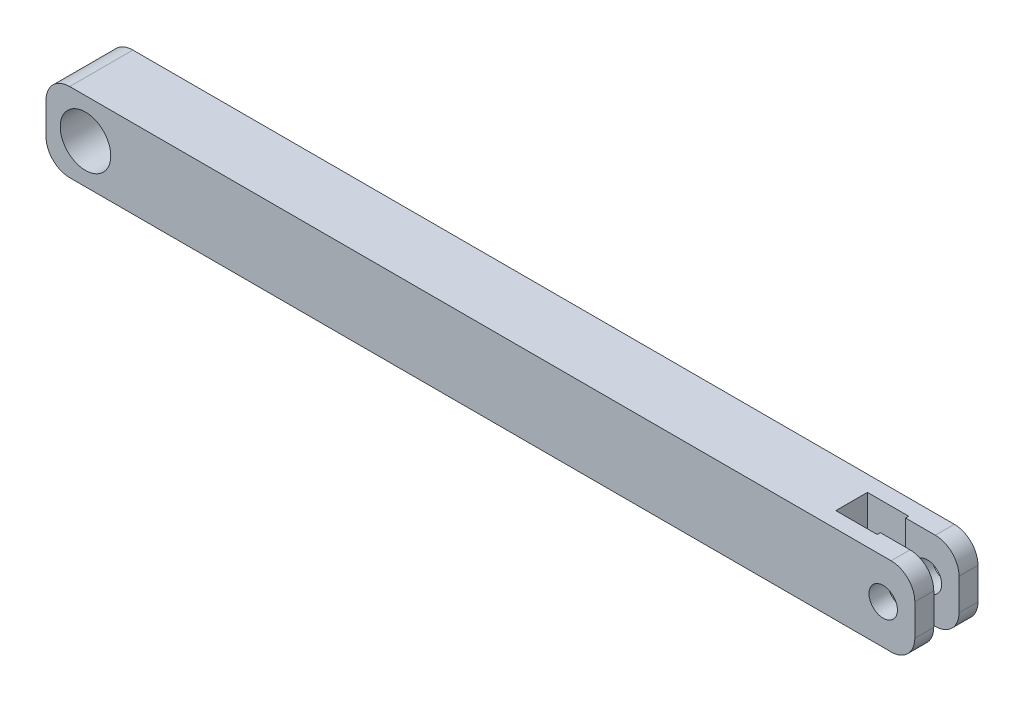
ISO-10303-21;
HEADER;
FILE_DESCRIPTION(('STEP AP214'),'2;1');
FILE_NAME('part.step','',(''),(''),'','','');
FILE_SCHEMA(('AUTOMOTIVE_DESIGN { 1 0 10303 214 1 1 1 1 }'));
ENDSEC;
DATA;
#1=APPLICATION_CONTEXT('core data for automotive mechanical design processes');
#2=APPLICATION_PROTOCOL_DEFINITION('international standard','automotive_design',2000,#1);
#3=PRODUCT_CONTEXT('',#1,'mechanical');
#4=PRODUCT('Part','Part','',(#3));
#5=PRODUCT_RELATED_PRODUCT_CATEGORY('part','',(#4));
#6=PRODUCT_DEFINITION_FORMATION('','',#4);
#7=PRODUCT_DEFINITION_CONTEXT('part definition',#1,'design');
#8=PRODUCT_DEFINITION('design','',#6,#7);
#9=PRODUCT_DEFINITION_SHAPE('','',#8);
#10=(LENGTH_UNIT() NAMED_UNIT(*) SI_UNIT(.MILLI.,.METRE.));
#11=(NAMED_UNIT(*) PLANE_ANGLE_UNIT() SI_UNIT($,.RADIAN.));
#12=(NAMED_UNIT(*) SI_UNIT($,.STERADIAN.) SOLID_ANGLE_UNIT());
#13=UNCERTAINTY_MEASURE_WITH_UNIT(LENGTH_MEASURE(1.E-05),#10,'distance_accuracy_value','');
#14=(GEOMETRIC_REPRESENTATION_CONTEXT(3) GLOBAL_UNCERTAINTY_ASSIGNED_CONTEXT((#13)) GLOBAL_UNIT_ASSIGNED_CONTEXT((#10,
#11,#12)) REPRESENTATION_CONTEXT('',''));
#15=CARTESIAN_POINT('',(0.,0.,0.));
#16=DIRECTION('',(0.,0.,1.));
#17=DIRECTION('',(1.,0.,0.));
#18=AXIS2_PLACEMENT_3D('',#15,#16,#17);
#19=CARTESIAN_POINT('',(0.,5.,0.));
#20=DIRECTION('',(0.,1.,0.));
#21=DIRECTION('',(0.,0.,1.));
#22=AXIS2_PLACEMENT_3D('',#19,#20,#21);
#23=PLANE('',#22);
#24=DIRECTION('',(-1.,0.,0.));
#25=VECTOR('',#24,1.);
#26=CARTESIAN_POINT('',(0.,5.,2.50000000000001));
#27=LINE('',#26,#25);
#28=CARTESIAN_POINT('',(51.6165924289674,5.,2.5));
#29=VERTEX_POINT('',#28);
#30=CARTESIAN_POINT('',(49.,5.,2.5));
#31=VERTEX_POINT('',#30);
#32=EDGE_CURVE('E267',#29,#31,#27,.T.);
#33=ORIENTED_EDGE('',*,*,#32,.T.);
#34=DIRECTION('',(0.,0.,1.));
#35=VECTOR('',#34,1.);
#36=CARTESIAN_POINT('',(49.,5.,0.700000000000001));
#37=LINE('',#36,#35);
#38=CARTESIAN_POINT('',(49.,5.,0.500000000000002));
#39=VERTEX_POINT('',#38);
#40=EDGE_CURVE('E272',#39,#31,#37,.T.);
#41=ORIENTED_EDGE('',*,*,#40,.F.);
#42=DIRECTION('',(-1.,0.,0.));
#43=VECTOR('',#42,1.);
#44=CARTESIAN_POINT('',(0.,5.,0.500000000000002));
#45=LINE('',#44,#43);
#46=CARTESIAN_POINT('',(51.6165924289674,5.,0.500000000000002));
#47=VERTEX_POINT('',#46);
#48=EDGE_CURVE('E264',#47,#39,#45,.T.);
#49=ORIENTED_EDGE('',*,*,#48,.F.);
#50=DIRECTION('',(0.,0.,-1.));
#51=VECTOR('',#50,1.);
#52=CARTESIAN_POINT('',(51.6165924289674,5.,0.));
#53=LINE('',#52,#51);
#54=CARTESIAN_POINT('',(51.6165924289674,5.,0.700000000000001));
#55=VERTEX_POINT('',#54);
#56=EDGE_CURVE('E255',#55,#47,#53,.T.);
#57=ORIENTED_EDGE('',*,*,#56,.F.);
#58=DIRECTION('',(-1.,0.,0.));
#59=VECTOR('',#58,1.);
#60=CARTESIAN_POINT('',(55.,5.,0.700000000000001));
#61=LINE('',#60,#59);
#62=CARTESIAN_POINT('',(53.5,5.,0.700000000000001));
#63=VERTEX_POINT('',#62);
#64=EDGE_CURVE('E269',#63,#55,#61,.T.);
#65=ORIENTED_EDGE('',*,*,#64,.F.);
#66=DIRECTION('',(0.,0.,-1.));
#67=VECTOR('',#66,1.);
#68=CARTESIAN_POINT('',(53.5,5.,0.));
#69=LINE('',#68,#67);
#70=CARTESIAN_POINT('',(53.5,5.,-0.500000000000004));
#71=VERTEX_POINT('',#70);
#72=EDGE_CURVE('E175',#63,#71,#69,.T.);
#73=ORIENTED_EDGE('',*,*,#72,.T.);
#74=DIRECTION('',(1.,0.,0.));
#75=VECTOR('',#74,1.);
#76=CARTESIAN_POINT('',(1.5,5.,-0.5));
#77=LINE('',#76,#75);
#78=CARTESIAN_POINT('',(1.5,5.,-0.5));
#79=VERTEX_POINT('',#78);
#80=EDGE_CURVE('E179',#79,#71,#77,.T.);
#81=ORIENTED_EDGE('',*,*,#80,.F.);
#82=DIRECTION('',(0.,0.,1.));
#83=VECTOR('',#82,1.);
#84=CARTESIAN_POINT('',(1.5,5.,3.));
#85=LINE('',#84,#83);
#86=CARTESIAN_POINT('',(1.5,5.,3.5));
#87=VERTEX_POINT('',#86);
#88=EDGE_CURVE('E166',#79,#87,#85,.T.);
#89=ORIENTED_EDGE('',*,*,#88,.T.);
#90=DIRECTION('',(-1.,0.,0.));
#91=VECTOR('',#90,1.);
#92=CARTESIAN_POINT('',(53.5,5.,3.5));
#93=LINE('',#92,#91);
#94=CARTESIAN_POINT('',(53.5,5.,3.5));
#95=VERTEX_POINT('',#94);
#96=EDGE_CURVE('E229',#95,#87,#93,.T.);
#97=ORIENTED_EDGE('',*,*,#96,.F.);
#98=CARTESIAN_POINT('',(53.5,5.,2.3));
#99=VERTEX_POINT('',#98);
#100=EDGE_CURVE('E295',#95,#99,#69,.T.);
#101=ORIENTED_EDGE('',*,*,#100,.T.);
#102=DIRECTION('',(1.,0.,0.));
#103=VECTOR('',#102,1.);
#104=CARTESIAN_POINT('',(55.,5.,2.3));
#105=LINE('',#104,#103);
#106=CARTESIAN_POINT('',(51.6165924289674,5.,2.3));
#107=VERTEX_POINT('',#106);
#108=EDGE_CURVE('E274',#107,#99,#105,.T.);
#109=ORIENTED_EDGE('',*,*,#108,.F.);
#110=DIRECTION('',(0.,0.,-1.));
#111=VECTOR('',#110,1.);
#112=CARTESIAN_POINT('',(51.6165924289674,5.,0.));
#113=LINE('',#112,#111);
#114=EDGE_CURVE('E56',#29,#107,#113,.T.);
#115=ORIENTED_EDGE('',*,*,#114,.F.);
#116=EDGE_LOOP('',(#33,#41,#49,#57,#65,#73,#81,#89,#97,#101,#109,#115));
#117=FACE_BOUND('',#116,.T.);
#118=ADVANCED_FACE('F41',(#117),#23,.T.);
#119=CARTESIAN_POINT('',(0.,0.,0.));
#120=DIRECTION('',(0.,1.,0.));
#121=DIRECTION('',(0.,0.,1.));
#122=AXIS2_PLACEMENT_3D('',#119,#120,#121);
#123=PLANE('',#122);
#124=DIRECTION('',(0.,0.,1.));
#125=VECTOR('',#124,1.);
#126=CARTESIAN_POINT('',(49.,0.,0.));
#127=LINE('',#126,#125);
#128=CARTESIAN_POINT('',(49.,0.,0.500000000000002));
#129=VERTEX_POINT('',#128);
#130=CARTESIAN_POINT('',(49.,0.,2.5));
#131=VERTEX_POINT('',#130);
#132=EDGE_CURVE('E321',#129,#131,#127,.T.);
#133=ORIENTED_EDGE('',*,*,#132,.T.);
#134=DIRECTION('',(1.,0.,0.));
#135=VECTOR('',#134,1.);
#136=CARTESIAN_POINT('',(0.,0.,2.50000000000001));
#137=LINE('',#136,#135);
#138=CARTESIAN_POINT('',(51.6165924289674,0.,2.5));
#139=VERTEX_POINT('',#138);
#140=EDGE_CURVE('E248',#131,#139,#137,.T.);
#141=ORIENTED_EDGE('',*,*,#140,.T.);
#142=DIRECTION('',(0.,0.,1.));
#143=VECTOR('',#142,1.);
#144=CARTESIAN_POINT('',(51.6165924289674,0.,0.));
#145=LINE('',#144,#143);
#146=CARTESIAN_POINT('',(51.6165924289674,0.,2.3));
#147=VERTEX_POINT('',#146);
#148=EDGE_CURVE('E245',#147,#139,#145,.T.);
#149=ORIENTED_EDGE('',*,*,#148,.F.);
#150=DIRECTION('',(1.,0.,0.));
#151=VECTOR('',#150,1.);
#152=CARTESIAN_POINT('',(0.,0.,2.30000000000003));
#153=LINE('',#152,#151);
#154=CARTESIAN_POINT('',(53.5,0.,2.3));
#155=VERTEX_POINT('',#154);
#156=EDGE_CURVE('E289',#147,#155,#153,.T.);
#157=ORIENTED_EDGE('',*,*,#156,.T.);
#158=DIRECTION('',(0.,0.,-1.));
#159=VECTOR('',#158,1.);
#160=CARTESIAN_POINT('',(53.5,0.,0.));
#161=LINE('',#160,#159);
#162=CARTESIAN_POINT('',(53.5,0.,3.5));
#163=VERTEX_POINT('',#162);
#164=EDGE_CURVE('E308',#155,#163,#161,.F.);
#165=ORIENTED_EDGE('',*,*,#164,.T.);
#166=DIRECTION('',(1.,0.,0.));
#167=VECTOR('',#166,1.);
#168=CARTESIAN_POINT('',(1.5,0.,3.5));
#169=LINE('',#168,#167);
#170=CARTESIAN_POINT('',(1.5,0.,3.5));
#171=VERTEX_POINT('',#170);
#172=EDGE_CURVE('E238',#171,#163,#169,.T.);
#173=ORIENTED_EDGE('',*,*,#172,.F.);
#174=DIRECTION('',(0.,0.,1.));
#175=VECTOR('',#174,1.);
#176=CARTESIAN_POINT('',(1.5,0.,0.));
#177=LINE('',#176,#175);
#178=CARTESIAN_POINT('',(1.5,0.,-0.5));
#179=VERTEX_POINT('',#178);
#180=EDGE_CURVE('E306',#171,#179,#177,.F.);
#181=ORIENTED_EDGE('',*,*,#180,.T.);
#182=DIRECTION('',(-1.,0.,0.));
#183=VECTOR('',#182,1.);
#184=CARTESIAN_POINT('',(53.5,0.,-0.500000000000004));
#185=LINE('',#184,#183);
#186=CARTESIAN_POINT('',(53.5,0.,-0.500000000000004));
#187=VERTEX_POINT('',#186);
#188=EDGE_CURVE('E208',#187,#179,#185,.T.);
#189=ORIENTED_EDGE('',*,*,#188,.F.);
#190=CARTESIAN_POINT('',(53.5,0.,0.700000000000001));
#191=VERTEX_POINT('',#190);
#192=EDGE_CURVE('E309',#187,#191,#161,.F.);
#193=ORIENTED_EDGE('',*,*,#192,.T.);
#194=DIRECTION('',(-1.,0.,0.));
#195=VECTOR('',#194,1.);
#196=CARTESIAN_POINT('',(0.,0.,0.700000000000007));
#197=LINE('',#196,#195);
#198=CARTESIAN_POINT('',(51.6165924289674,0.,0.700000000000001));
#199=VERTEX_POINT('',#198);
#200=EDGE_CURVE('E280',#191,#199,#197,.T.);
#201=ORIENTED_EDGE('',*,*,#200,.T.);
#202=DIRECTION('',(0.,0.,1.));
#203=VECTOR('',#202,1.);
#204=CARTESIAN_POINT('',(51.6165924289674,0.,0.));
#205=LINE('',#204,#203);
#206=CARTESIAN_POINT('',(51.6165924289674,0.,0.500000000000002));
#207=VERTEX_POINT('',#206);
#208=EDGE_CURVE('E63',#207,#199,#205,.T.);
#209=ORIENTED_EDGE('',*,*,#208,.F.);
#210=DIRECTION('',(1.,0.,0.));
#211=VECTOR('',#210,1.);
#212=CARTESIAN_POINT('',(0.,0.,0.500000000000002));
#213=LINE('',#212,#211);
#214=EDGE_CURVE('E241',#129,#207,#213,.T.);
#215=ORIENTED_EDGE('',*,*,#214,.F.);
#216=EDGE_LOOP('',(#133,#141,#149,#157,#165,#173,#181,#189,#193,#201,#209,#215));
#217=FACE_BOUND('',#216,.T.);
#218=ADVANCED_FACE('F327',(#217),#123,.F.);
#219=CARTESIAN_POINT('',(55.,5.,3.));
#220=DIRECTION('',(-1.,0.,0.));
#221=DIRECTION('',(0.,0.,1.));
#222=AXIS2_PLACEMENT_3D('',#219,#220,#221);
#223=PLANE('',#222);
#224=DIRECTION('',(0.,0.,-1.));
#225=VECTOR('',#224,1.);
#226=CARTESIAN_POINT('',(55.,1.5,3.));
#227=LINE('',#226,#225);
#228=CARTESIAN_POINT('',(55.,1.5,3.5));
#229=VERTEX_POINT('',#228);
#230=CARTESIAN_POINT('',(55.,1.5,2.3));
#231=VERTEX_POINT('',#230);
#232=EDGE_CURVE('E299',#229,#231,#227,.T.);
#233=ORIENTED_EDGE('',*,*,#232,.T.);
#234=DIRECTION('',(0.,1.,0.));
#235=VECTOR('',#234,1.);
#236=CARTESIAN_POINT('',(55.,-5.,2.3));
#237=LINE('',#236,#235);
#238=CARTESIAN_POINT('',(55.,3.5,2.3));
#239=VERTEX_POINT('',#238);
#240=EDGE_CURVE('E277',#231,#239,#237,.T.);
#241=ORIENTED_EDGE('',*,*,#240,.T.);
#242=DIRECTION('',(0.,0.,-1.));
#243=VECTOR('',#242,1.);
#244=CARTESIAN_POINT('',(55.,3.5,3.));
#245=LINE('',#244,#243);
#246=CARTESIAN_POINT('',(55.,3.5,3.5));
#247=VERTEX_POINT('',#246);
#248=EDGE_CURVE('E302',#239,#247,#245,.F.);
#249=ORIENTED_EDGE('',*,*,#248,.T.);
#250=DIRECTION('',(0.,1.,0.));
#251=VECTOR('',#250,1.);
#252=CARTESIAN_POINT('',(55.,1.5,3.5));
#253=LINE('',#252,#251);
#254=EDGE_CURVE('E223',#229,#247,#253,.T.);
#255=ORIENTED_EDGE('',*,*,#254,.F.);
#256=EDGE_LOOP('',(#233,#241,#249,#255));
#257=FACE_BOUND('',#256,.T.);
#258=ADVANCED_FACE('F366',(#257),#223,.F.);
#259=CARTESIAN_POINT('',(53.,2.5,3.001));
#260=DIRECTION('',(0.,0.,-1.));
#261=DIRECTION('',(-1.,0.,0.));
#262=AXIS2_PLACEMENT_3D('',#259,#260,#261);
#263=CYLINDRICAL_SURFACE('',#262,0.900000000000004);
#264=CARTESIAN_POINT('',(53.,2.5,2.3));
#265=DIRECTION('',(0.,0.,1.));
#266=DIRECTION('',(1.,0.,0.));
#267=AXIS2_PLACEMENT_3D('',#264,#265,#266);
#268=CIRCLE('',#267,0.900000000000004);
#269=CARTESIAN_POINT('',(53.9,2.5,2.3));
#270=VERTEX_POINT('',#269);
#271=EDGE_CURVE('E176',#270,#270,#268,.T.);
#272=ORIENTED_EDGE('',*,*,#271,.F.);
#273=EDGE_LOOP('',(#272));
#274=FACE_BOUND('',#273,.T.);
#275=CARTESIAN_POINT('',(53.,2.5,3.5));
#276=DIRECTION('',(0.,0.,1.));
#277=DIRECTION('',(1.,0.,0.));
#278=AXIS2_PLACEMENT_3D('',#275,#276,#277);
#279=CIRCLE('',#278,0.900000000000004);
#280=CARTESIAN_POINT('',(53.9,2.5,3.5));
#281=VERTEX_POINT('',#280);
#282=EDGE_CURVE('E214',#281,#281,#279,.T.);
#283=ORIENTED_EDGE('',*,*,#282,.T.);
#284=EDGE_LOOP('',(#283));
#285=FACE_BOUND('',#284,.T.);
#286=ADVANCED_FACE('F356',(#274,#285),#263,.F.);
#287=CARTESIAN_POINT('',(53.5,3.5,0.));
#288=DIRECTION('',(0.,0.,1.));
#289=DIRECTION('',(1.,0.,0.));
#290=AXIS2_PLACEMENT_3D('',#287,#288,#289);
#291=CYLINDRICAL_SURFACE('',#290,1.5);
#292=CARTESIAN_POINT('',(53.5,3.5,2.3));
#293=DIRECTION('',(0.,0.,1.));
#294=DIRECTION('',(1.,0.,0.));
#295=AXIS2_PLACEMENT_3D('',#292,#293,#294);
#296=CIRCLE('',#295,1.5);
#297=EDGE_CURVE('E291',#99,#239,#296,.F.);
#298=ORIENTED_EDGE('',*,*,#297,.F.);
#299=ORIENTED_EDGE('',*,*,#100,.F.);
#300=CARTESIAN_POINT('',(53.5,3.5,3.5));
#301=DIRECTION('',(0.,0.,1.));
#302=DIRECTION('',(1.,0.,0.));
#303=AXIS2_PLACEMENT_3D('',#300,#301,#302);
#304=CIRCLE('',#303,1.5);
#305=EDGE_CURVE('E226',#247,#95,#304,.T.);
#306=ORIENTED_EDGE('',*,*,#305,.F.);
#307=ORIENTED_EDGE('',*,*,#248,.F.);
#308=EDGE_LOOP('',(#298,#299,#306,#307));
#309=FACE_BOUND('',#308,.T.);
#310=ADVANCED_FACE('F345',(#309),#291,.T.);
#311=CARTESIAN_POINT('',(53.5,1.5,3.));
#312=DIRECTION('',(0.,0.,-1.));
#313=DIRECTION('',(-1.,0.,0.));
#314=AXIS2_PLACEMENT_3D('',#311,#312,#313);
#315=CYLINDRICAL_SURFACE('',#314,1.5);
#316=CARTESIAN_POINT('',(53.5,1.5,2.3));
#317=DIRECTION('',(0.,0.,1.));
#318=DIRECTION('',(1.,0.,0.));
#319=AXIS2_PLACEMENT_3D('',#316,#317,#318);
#320=CIRCLE('',#319,1.5);
#321=EDGE_CURVE('E318',#231,#155,#320,.F.);
#322=ORIENTED_EDGE('',*,*,#321,.F.);
#323=ORIENTED_EDGE('',*,*,#232,.F.);
#324=CARTESIAN_POINT('',(53.5,1.5,3.5));
#325=DIRECTION('',(0.,0.,1.));
#326=DIRECTION('',(1.,0.,0.));
#327=AXIS2_PLACEMENT_3D('',#324,#325,#326);
#328=CIRCLE('',#327,1.5);
#329=EDGE_CURVE('E220',#163,#229,#328,.T.);
#330=ORIENTED_EDGE('',*,*,#329,.F.);
#331=ORIENTED_EDGE('',*,*,#164,.F.);
#332=EDGE_LOOP('',(#322,#323,#330,#331));
#333=FACE_BOUND('',#332,.T.);
#334=ADVANCED_FACE('F352',(#333),#315,.T.);
#335=CARTESIAN_POINT('',(0.,5.,0.));
#336=DIRECTION('',(1.,0.,0.));
#337=DIRECTION('',(0.,0.,-1.));
#338=AXIS2_PLACEMENT_3D('',#335,#336,#337);
#339=PLANE('',#338);
#340=DIRECTION('',(0.,0.,1.));
#341=VECTOR('',#340,1.);
#342=CARTESIAN_POINT('',(0.,3.5,0.));
#343=LINE('',#342,#341);
#344=CARTESIAN_POINT('',(0.,3.5,3.5));
#345=VERTEX_POINT('',#344);
#346=CARTESIAN_POINT('',(0.,3.5,-0.5));
#347=VERTEX_POINT('',#346);
#348=EDGE_CURVE('E312',#345,#347,#343,.F.);
#349=ORIENTED_EDGE('',*,*,#348,.T.);
#350=DIRECTION('',(0.,1.,0.));
#351=VECTOR('',#350,1.);
#352=CARTESIAN_POINT('',(0.,1.5,-0.5));
#353=LINE('',#352,#351);
#354=CARTESIAN_POINT('',(0.,1.5,-0.5));
#355=VERTEX_POINT('',#354);
#356=EDGE_CURVE('E193',#355,#347,#353,.T.);
#357=ORIENTED_EDGE('',*,*,#356,.F.);
#358=DIRECTION('',(0.,0.,1.));
#359=VECTOR('',#358,1.);
#360=CARTESIAN_POINT('',(0.,1.5,0.));
#361=LINE('',#360,#359);
#362=CARTESIAN_POINT('',(0.,1.5,3.5));
#363=VERTEX_POINT('',#362);
#364=EDGE_CURVE('E314',#355,#363,#361,.T.);
#365=ORIENTED_EDGE('',*,*,#364,.T.);
#366=DIRECTION('',(0.,-1.,0.));
#367=VECTOR('',#366,1.);
#368=CARTESIAN_POINT('',(0.,3.5,3.5));
#369=LINE('',#368,#367);
#370=EDGE_CURVE('E232',#345,#363,#369,.T.);
#371=ORIENTED_EDGE('',*,*,#370,.F.);
#372=EDGE_LOOP('',(#349,#357,#365,#371));
#373=FACE_BOUND('',#372,.T.);
#374=ADVANCED_FACE('F371',(#373),#339,.F.);
#375=CARTESIAN_POINT('',(55.,3.5,-0.500000000000004));
#376=VERTEX_POINT('',#375);
#377=CARTESIAN_POINT('',(55.,3.5,0.700000000000001));
#378=VERTEX_POINT('',#377);
#379=EDGE_CURVE('E303',#376,#378,#245,.F.);
#380=ORIENTED_EDGE('',*,*,#379,.T.);
#381=DIRECTION('',(0.,1.,0.));
#382=VECTOR('',#381,1.);
#383=CARTESIAN_POINT('',(55.,-5.,0.700000000000001));
#384=LINE('',#383,#382);
#385=CARTESIAN_POINT('',(55.,1.5,0.7));
#386=VERTEX_POINT('',#385);
#387=EDGE_CURVE('E276',#386,#378,#384,.T.);
#388=ORIENTED_EDGE('',*,*,#387,.F.);
#389=CARTESIAN_POINT('',(55.,1.5,-0.500000000000004));
#390=VERTEX_POINT('',#389);
#391=EDGE_CURVE('E298',#386,#390,#227,.T.);
#392=ORIENTED_EDGE('',*,*,#391,.T.);
#393=DIRECTION('',(0.,-1.,0.));
#394=VECTOR('',#393,1.);
#395=CARTESIAN_POINT('',(55.,3.5,-0.500000000000004));
#396=LINE('',#395,#394);
#397=EDGE_CURVE('E202',#376,#390,#396,.T.);
#398=ORIENTED_EDGE('',*,*,#397,.F.);
#399=EDGE_LOOP('',(#380,#388,#392,#398));
#400=FACE_BOUND('',#399,.T.);
#401=ADVANCED_FACE('F337',(#400),#223,.F.);
#402=CARTESIAN_POINT('',(2.5,2.5,-0.00100000000000013));
#403=DIRECTION('',(0.,0.,1.));
#404=DIRECTION('',(1.,0.,0.));
#405=AXIS2_PLACEMENT_3D('',#402,#403,#404);
#406=CYLINDRICAL_SURFACE('',#405,1.6);
#407=CARTESIAN_POINT('',(2.5,2.5,3.5));
#408=DIRECTION('',(0.,0.,1.));
#409=DIRECTION('',(1.,0.,0.));
#410=AXIS2_PLACEMENT_3D('',#407,#408,#409);
#411=CIRCLE('',#410,1.6);
#412=CARTESIAN_POINT('',(4.1,2.5,3.5));
#413=VERTEX_POINT('',#412);
#414=EDGE_CURVE('E217',#413,#413,#411,.T.);
#415=CARTESIAN_POINT('',(2.5,2.5,-0.5));
#416=DIRECTION('',(0.,0.,-1.));
#417=DIRECTION('',(-1.,0.,0.));
#418=AXIS2_PLACEMENT_3D('',#415,#416,#417);
#419=CIRCLE('',#418,1.6);
#420=CARTESIAN_POINT('',(4.1,2.5,-0.5));
#421=VERTEX_POINT('',#420);
#422=EDGE_CURVE('E197',#421,#421,#419,.T.);
#423=CARTESIAN_POINT('',(4.1,2.5,3.5));
#424=CARTESIAN_POINT('',(4.1,2.5,3.45833333333333));
#425=CARTESIAN_POINT('',(4.1,2.5,3.41666666666667));
#426=CARTESIAN_POINT('',(4.1,2.5,3.33333333333333));
#427=CARTESIAN_POINT('',(4.1,2.5,3.29166666666667));
#428=CARTESIAN_POINT('',(4.1,2.5,3.20833333333333));
#429=CARTESIAN_POINT('',(4.1,2.5,3.16666666666667));
#430=CARTESIAN_POINT('',(4.1,2.5,3.08333333333333));
#431=CARTESIAN_POINT('',(4.1,2.5,3.04166666666667));
#432=CARTESIAN_POINT('',(4.1,2.5,2.95833333333333));
#433=CARTESIAN_POINT('',(4.1,2.5,2.91666666666667));
#434=CARTESIAN_POINT('',(4.1,2.5,2.83333333333333));
#435=CARTESIAN_POINT('',(4.1,2.5,2.79166666666667));
#436=CARTESIAN_POINT('',(4.1,2.5,2.70833333333333));
#437=CARTESIAN_POINT('',(4.1,2.5,2.66666666666667));
#438=CARTESIAN_POINT('',(4.1,2.5,2.58333333333333));
#439=CARTESIAN_POINT('',(4.1,2.5,2.54166666666667));
#440=CARTESIAN_POINT('',(4.1,2.5,2.45833333333333));
#441=CARTESIAN_POINT('',(4.1,2.5,2.41666666666667));
#442=CARTESIAN_POINT('',(4.1,2.5,2.33333333333333));
#443=CARTESIAN_POINT('',(4.1,2.5,2.29166666666667));
#444=CARTESIAN_POINT('',(4.1,2.5,2.20833333333333));
#445=CARTESIAN_POINT('',(4.1,2.5,2.16666666666667));
#446=CARTESIAN_POINT('',(4.1,2.5,2.08333333333333));
#447=CARTESIAN_POINT('',(4.1,2.5,2.04166666666667));
#448=CARTESIAN_POINT('',(4.1,2.5,1.95833333333333));
#449=CARTESIAN_POINT('',(4.1,2.5,1.91666666666667));
#450=CARTESIAN_POINT('',(4.1,2.5,1.83333333333333));
#451=CARTESIAN_POINT('',(4.1,2.5,1.79166666666667));
#452=CARTESIAN_POINT('',(4.1,2.5,1.70833333333333));
#453=CARTESIAN_POINT('',(4.1,2.5,1.66666666666667));
#454=CARTESIAN_POINT('',(4.1,2.5,1.58333333333333));
#455=CARTESIAN_POINT('',(4.1,2.5,1.54166666666667));
#456=CARTESIAN_POINT('',(4.1,2.5,1.45833333333333));
#457=CARTESIAN_POINT('',(4.1,2.5,1.41666666666667));
#458=CARTESIAN_POINT('',(4.1,2.5,1.33333333333333));
#459=CARTESIAN_POINT('',(4.1,2.5,1.29166666666667));
#460=CARTESIAN_POINT('',(4.1,2.5,1.20833333333333));
#461=CARTESIAN_POINT('',(4.1,2.5,1.16666666666667));
#462=CARTESIAN_POINT('',(4.1,2.5,1.08333333333333));
#463=CARTESIAN_POINT('',(4.1,2.5,1.04166666666667));
#464=CARTESIAN_POINT('',(4.1,2.5,0.958333333333333));
#465=CARTESIAN_POINT('',(4.1,2.5,0.916666666666666));
#466=CARTESIAN_POINT('',(4.1,2.5,0.833333333333333));
#467=CARTESIAN_POINT('',(4.1,2.5,0.791666666666666));
#468=CARTESIAN_POINT('',(4.1,2.5,0.708333333333333));
#469=CARTESIAN_POINT('',(4.1,2.5,0.666666666666666));
#470=CARTESIAN_POINT('',(4.1,2.5,0.583333333333333));
#471=CARTESIAN_POINT('',(4.1,2.5,0.541666666666666));
#472=CARTESIAN_POINT('',(4.1,2.5,0.458333333333333));
#473=CARTESIAN_POINT('',(4.1,2.5,0.416666666666666));
#474=CARTESIAN_POINT('',(4.1,2.5,0.333333333333333));
#475=CARTESIAN_POINT('',(4.1,2.5,0.291666666666666));
#476=CARTESIAN_POINT('',(4.1,2.5,0.208333333333333));
#477=CARTESIAN_POINT('',(4.1,2.5,0.166666666666666));
#478=CARTESIAN_POINT('',(4.1,2.5,0.083333333333333));
#479=CARTESIAN_POINT('',(4.1,2.5,0.0416666666666663));
#480=CARTESIAN_POINT('',(4.1,2.5,-0.0416666666666671));
#481=CARTESIAN_POINT('',(4.1,2.5,-0.0833333333333338));
#482=CARTESIAN_POINT('',(4.1,2.5,-0.166666666666667));
#483=CARTESIAN_POINT('',(4.1,2.5,-0.208333333333334));
#484=CARTESIAN_POINT('',(4.1,2.5,-0.291666666666667));
#485=CARTESIAN_POINT('',(4.1,2.5,-0.333333333333334));
#486=CARTESIAN_POINT('',(4.1,2.5,-0.416666666666667));
#487=CARTESIAN_POINT('',(4.1,2.5,-0.458333333333334));
#488=CARTESIAN_POINT('',(4.1,2.5,-0.5));
#489=B_SPLINE_CURVE_WITH_KNOTS('',3,(#423,#424,#425,#426,#427,#428,#429,#430,#431,#432,#433,
#434,#435,#436,#437,#438,#439,#440,#441,#442,#443,#444,#445,#446,#447,#448,#449,#450,#451,#452,
#453,#454,#455,#456,#457,#458,#459,#460,#461,#462,#463,#464,#465,#466,#467,#468,#469,#470,#471,
#472,#473,#474,#475,#476,#477,#478,#479,#480,#481,#482,#483,#484,#485,#486,#487,#488),
.UNSPECIFIED.,.F.,.F.,(4,2,2,2,2,2,2,2,2,2,2,2,2,2,2,2,2,2,2,2,2,2,2,2,2,2,2,2,2,2,2,2,4),(0.,
0.125,0.25,0.375,0.5,0.625,0.75,0.875,1.,1.125,1.25,1.375,1.5,1.625,1.75,1.875,2.,2.125,2.25,
2.375,2.5,2.625,2.75,2.875,3.,3.125,3.25,3.375,3.5,3.625,3.75,3.875,4.),.UNSPECIFIED.);
#490=EDGE_CURVE('BSEAM353',#413,#421,#489,.T.);
#491=ORIENTED_EDGE('',*,*,#414,.T.);
#492=ORIENTED_EDGE('',*,*,#422,.T.);
#493=ORIENTED_EDGE('',*,*,#490,.T.);
#494=ORIENTED_EDGE('',*,*,#490,.F.);
#495=EDGE_LOOP('',(#491,#493,#492,#494));
#496=FACE_BOUND('',#495,.T.);
#497=ADVANCED_FACE('F353',(#496),#406,.F.);
#498=CARTESIAN_POINT('',(53.,2.5,0.700000000000001));
#499=DIRECTION('',(0.,0.,-1.));
#500=DIRECTION('',(-1.,0.,0.));
#501=AXIS2_PLACEMENT_3D('',#498,#499,#500);
#502=CIRCLE('',#501,0.900000000000004);
#503=CARTESIAN_POINT('',(52.1,2.5,0.700000000000001));
#504=VERTEX_POINT('',#503);
#505=EDGE_CURVE('E286',#504,#504,#502,.T.);
#506=ORIENTED_EDGE('',*,*,#505,.F.);
#507=EDGE_LOOP('',(#506));
#508=FACE_BOUND('',#507,.T.);
#509=CARTESIAN_POINT('',(53.,2.5,-0.500000000000004));
#510=DIRECTION('',(0.,0.,-1.));
#511=DIRECTION('',(-1.,0.,0.));
#512=AXIS2_PLACEMENT_3D('',#509,#510,#511);
#513=CIRCLE('',#512,0.900000000000004);
#514=CARTESIAN_POINT('',(52.1,2.5,-0.500000000000004));
#515=VERTEX_POINT('',#514);
#516=EDGE_CURVE('E194',#515,#515,#513,.T.);
#517=ORIENTED_EDGE('',*,*,#516,.T.);
#518=EDGE_LOOP('',(#517));
#519=FACE_BOUND('',#518,.T.);
#520=ADVANCED_FACE('F343',(#508,#519),#263,.F.);
#521=CARTESIAN_POINT('',(53.5,3.5,0.700000000000001));
#522=DIRECTION('',(0.,0.,-1.));
#523=DIRECTION('',(-1.,0.,0.));
#524=AXIS2_PLACEMENT_3D('',#521,#522,#523);
#525=CIRCLE('',#524,1.5);
#526=EDGE_CURVE('E284',#378,#63,#525,.F.);
#527=ORIENTED_EDGE('',*,*,#526,.F.);
#528=ORIENTED_EDGE('',*,*,#379,.F.);
#529=CARTESIAN_POINT('',(53.5,3.5,-0.500000000000004));
#530=DIRECTION('',(0.,0.,-1.));
#531=DIRECTION('',(-1.,0.,0.));
#532=AXIS2_PLACEMENT_3D('',#529,#530,#531);
#533=CIRCLE('',#532,1.5);
#534=EDGE_CURVE('E186',#71,#376,#533,.T.);
#535=ORIENTED_EDGE('',*,*,#534,.F.);
#536=ORIENTED_EDGE('',*,*,#72,.F.);
#537=EDGE_LOOP('',(#527,#528,#535,#536));
#538=FACE_BOUND('',#537,.T.);
#539=ADVANCED_FACE('F341',(#538),#291,.T.);
#540=CARTESIAN_POINT('',(53.5,1.5,0.700000000000001));
#541=DIRECTION('',(0.,0.,-1.));
#542=DIRECTION('',(-1.,0.,0.));
#543=AXIS2_PLACEMENT_3D('',#540,#541,#542);
#544=CIRCLE('',#543,1.5);
#545=EDGE_CURVE('E316',#191,#386,#544,.F.);
#546=ORIENTED_EDGE('',*,*,#545,.F.);
#547=ORIENTED_EDGE('',*,*,#192,.F.);
#548=CARTESIAN_POINT('',(53.5,1.5,-0.500000000000004));
#549=DIRECTION('',(0.,0.,-1.));
#550=DIRECTION('',(-1.,0.,0.));
#551=AXIS2_PLACEMENT_3D('',#548,#549,#550);
#552=CIRCLE('',#551,1.5);
#553=EDGE_CURVE('E205',#390,#187,#552,.T.);
#554=ORIENTED_EDGE('',*,*,#553,.F.);
#555=ORIENTED_EDGE('',*,*,#391,.F.);
#556=EDGE_LOOP('',(#546,#547,#554,#555));
#557=FACE_BOUND('',#556,.T.);
#558=ADVANCED_FACE('F332',(#557),#315,.T.);
#559=CARTESIAN_POINT('',(1.5,1.5,0.));
#560=DIRECTION('',(0.,0.,1.));
#561=DIRECTION('',(1.,0.,0.));
#562=AXIS2_PLACEMENT_3D('',#559,#560,#561);
#563=CYLINDRICAL_SURFACE('',#562,1.5);
#564=ORIENTED_EDGE('',*,*,#364,.F.);
#565=CARTESIAN_POINT('',(1.5,1.5,-0.5));
#566=DIRECTION('',(0.,0.,-1.));
#567=DIRECTION('',(-1.,0.,0.));
#568=AXIS2_PLACEMENT_3D('',#565,#566,#567);
#569=CIRCLE('',#568,1.5);
#570=EDGE_CURVE('E211',#179,#355,#569,.T.);
#571=ORIENTED_EDGE('',*,*,#570,.F.);
#572=ORIENTED_EDGE('',*,*,#180,.F.);
#573=CARTESIAN_POINT('',(1.5,1.5,3.5));
#574=DIRECTION('',(0.,0.,1.));
#575=DIRECTION('',(1.,0.,0.));
#576=AXIS2_PLACEMENT_3D('',#573,#574,#575);
#577=CIRCLE('',#576,1.5);
#578=EDGE_CURVE('E235',#363,#171,#577,.T.);
#579=ORIENTED_EDGE('',*,*,#578,.F.);
#580=EDGE_LOOP('',(#564,#571,#572,#579));
#581=FACE_BOUND('',#580,.T.);
#582=ADVANCED_FACE('F350',(#581),#563,.T.);
#583=CARTESIAN_POINT('',(1.5,3.5,0.));
#584=DIRECTION('',(0.,0.,-1.));
#585=DIRECTION('',(-1.,0.,0.));
#586=AXIS2_PLACEMENT_3D('',#583,#584,#585);
#587=CYLINDRICAL_SURFACE('',#586,1.5);
#588=ORIENTED_EDGE('',*,*,#88,.F.);
#589=CARTESIAN_POINT('',(1.5,3.5,-0.5));
#590=DIRECTION('',(0.,0.,-1.));
#591=DIRECTION('',(-1.,0.,0.));
#592=AXIS2_PLACEMENT_3D('',#589,#590,#591);
#593=CIRCLE('',#592,1.5);
#594=EDGE_CURVE('E169',#347,#79,#593,.T.);
#595=ORIENTED_EDGE('',*,*,#594,.F.);
#596=ORIENTED_EDGE('',*,*,#348,.F.);
#597=CARTESIAN_POINT('',(1.5,3.5,3.5));
#598=DIRECTION('',(0.,0.,1.));
#599=DIRECTION('',(1.,0.,0.));
#600=AXIS2_PLACEMENT_3D('',#597,#598,#599);
#601=CIRCLE('',#600,1.5);
#602=EDGE_CURVE('E171',#87,#345,#601,.T.);
#603=ORIENTED_EDGE('',*,*,#602,.F.);
#604=EDGE_LOOP('',(#588,#595,#596,#603));
#605=FACE_BOUND('',#604,.T.);
#606=ADVANCED_FACE('F43',(#605),#587,.T.);
#607=CARTESIAN_POINT('',(49.,-5.,0.700000000000001));
#608=DIRECTION('',(-1.,0.,0.));
#609=DIRECTION('',(0.,0.,1.));
#610=AXIS2_PLACEMENT_3D('',#607,#608,#609);
#611=PLANE('',#610);
#612=ORIENTED_EDGE('',*,*,#132,.F.);
#613=DIRECTION('',(0.,-1.,0.));
#614=VECTOR('',#613,1.);
#615=CARTESIAN_POINT('',(49.,10.,0.500000000000002));
#616=LINE('',#615,#614);
#617=EDGE_CURVE('E251',#39,#129,#616,.T.);
#618=ORIENTED_EDGE('',*,*,#617,.F.);
#619=ORIENTED_EDGE('',*,*,#40,.T.);
#620=DIRECTION('',(0.,-1.,0.));
#621=VECTOR('',#620,1.);
#622=CARTESIAN_POINT('',(49.,10.,2.5));
#623=LINE('',#622,#621);
#624=EDGE_CURVE('E252',#31,#131,#623,.T.);
#625=ORIENTED_EDGE('',*,*,#624,.T.);
#626=EDGE_LOOP('',(#612,#618,#619,#625));
#627=FACE_BOUND('',#626,.T.);
#628=ADVANCED_FACE('F404',(#627),#611,.F.);
#629=CARTESIAN_POINT('',(55.,-5.,2.3));
#630=DIRECTION('',(0.,0.,1.));
#631=DIRECTION('',(1.,0.,0.));
#632=AXIS2_PLACEMENT_3D('',#629,#630,#631);
#633=PLANE('',#632);
#634=ORIENTED_EDGE('',*,*,#271,.T.);
#635=EDGE_LOOP('',(#634));
#636=FACE_BOUND('',#635,.T.);
#637=ORIENTED_EDGE('',*,*,#321,.T.);
#638=ORIENTED_EDGE('',*,*,#156,.F.);
#639=DIRECTION('',(0.,1.,0.));
#640=VECTOR('',#639,1.);
#641=CARTESIAN_POINT('',(51.6165924289674,-5.,2.3));
#642=LINE('',#641,#640);
#643=EDGE_CURVE('E11',#147,#107,#642,.T.);
#644=ORIENTED_EDGE('',*,*,#643,.T.);
#645=ORIENTED_EDGE('',*,*,#108,.T.);
#646=ORIENTED_EDGE('',*,*,#297,.T.);
#647=ORIENTED_EDGE('',*,*,#240,.F.);
#648=EDGE_LOOP('',(#637,#638,#644,#645,#646,#647));
#649=FACE_BOUND('',#648,.T.);
#650=ADVANCED_FACE('F388',(#636,#649),#633,.F.);
#651=CARTESIAN_POINT('',(55.,-5.,0.700000000000001));
#652=DIRECTION('',(0.,0.,-1.));
#653=DIRECTION('',(-1.,0.,0.));
#654=AXIS2_PLACEMENT_3D('',#651,#652,#653);
#655=PLANE('',#654);
#656=ORIENTED_EDGE('',*,*,#505,.T.);
#657=EDGE_LOOP('',(#656));
#658=FACE_BOUND('',#657,.T.);
#659=ORIENTED_EDGE('',*,*,#526,.T.);
#660=ORIENTED_EDGE('',*,*,#64,.T.);
#661=DIRECTION('',(0.,-1.,0.));
#662=VECTOR('',#661,1.);
#663=CARTESIAN_POINT('',(51.6165924289674,-5.,0.700000000000001));
#664=LINE('',#663,#662);
#665=EDGE_CURVE('E49',#55,#199,#664,.T.);
#666=ORIENTED_EDGE('',*,*,#665,.T.);
#667=ORIENTED_EDGE('',*,*,#200,.F.);
#668=ORIENTED_EDGE('',*,*,#545,.T.);
#669=ORIENTED_EDGE('',*,*,#387,.T.);
#670=EDGE_LOOP('',(#659,#660,#666,#667,#668,#669));
#671=FACE_BOUND('',#670,.T.);
#672=ADVANCED_FACE('F323',(#658,#671),#655,.F.);
#673=CARTESIAN_POINT('',(51.6165924289674,10.,0.));
#674=DIRECTION('',(1.,0.,0.));
#675=DIRECTION('',(0.,0.,-1.));
#676=AXIS2_PLACEMENT_3D('',#673,#674,#675);
#677=PLANE('',#676);
#678=ORIENTED_EDGE('',*,*,#56,.T.);
#679=DIRECTION('',(0.,-1.,0.));
#680=VECTOR('',#679,1.);
#681=CARTESIAN_POINT('',(51.6165924289674,10.,0.500000000000002));
#682=LINE('',#681,#680);
#683=EDGE_CURVE('E258',#47,#207,#682,.T.);
#684=ORIENTED_EDGE('',*,*,#683,.T.);
#685=ORIENTED_EDGE('',*,*,#208,.T.);
#686=ORIENTED_EDGE('',*,*,#665,.F.);
#687=EDGE_LOOP('',(#678,#684,#685,#686));
#688=FACE_BOUND('',#687,.T.);
#689=ADVANCED_FACE('F409',(#688),#677,.F.);
#690=CARTESIAN_POINT('',(0.,10.,0.500000000000002));
#691=DIRECTION('',(0.,0.,-1.));
#692=DIRECTION('',(-1.,0.,0.));
#693=AXIS2_PLACEMENT_3D('',#690,#691,#692);
#694=PLANE('',#693);
#695=ORIENTED_EDGE('',*,*,#48,.T.);
#696=ORIENTED_EDGE('',*,*,#617,.T.);
#697=ORIENTED_EDGE('',*,*,#214,.T.);
#698=ORIENTED_EDGE('',*,*,#683,.F.);
#699=EDGE_LOOP('',(#695,#696,#697,#698));
#700=FACE_BOUND('',#699,.T.);
#701=ADVANCED_FACE('F407',(#700),#694,.F.);
#702=CARTESIAN_POINT('',(0.,10.,2.50000000000001));
#703=DIRECTION('',(0.,0.,-1.));
#704=DIRECTION('',(-1.,0.,0.));
#705=AXIS2_PLACEMENT_3D('',#702,#703,#704);
#706=PLANE('',#705);
#707=DIRECTION('',(0.,-1.,0.));
#708=VECTOR('',#707,1.);
#709=CARTESIAN_POINT('',(51.6165924289674,10.,2.5));
#710=LINE('',#709,#708);
#711=EDGE_CURVE('E256',#29,#139,#710,.T.);
#712=ORIENTED_EDGE('',*,*,#711,.T.);
#713=ORIENTED_EDGE('',*,*,#140,.F.);
#714=ORIENTED_EDGE('',*,*,#624,.F.);
#715=ORIENTED_EDGE('',*,*,#32,.F.);
#716=EDGE_LOOP('',(#712,#713,#714,#715));
#717=FACE_BOUND('',#716,.T.);
#718=ADVANCED_FACE('F402',(#717),#706,.T.);
#719=CARTESIAN_POINT('',(51.6165924289674,10.,0.));
#720=DIRECTION('',(1.,0.,0.));
#721=DIRECTION('',(0.,0.,-1.));
#722=AXIS2_PLACEMENT_3D('',#719,#720,#721);
#723=PLANE('',#722);
#724=ORIENTED_EDGE('',*,*,#114,.T.);
#725=ORIENTED_EDGE('',*,*,#643,.F.);
#726=ORIENTED_EDGE('',*,*,#148,.T.);
#727=ORIENTED_EDGE('',*,*,#711,.F.);
#728=EDGE_LOOP('',(#724,#725,#726,#727));
#729=FACE_BOUND('',#728,.T.);
#730=ADVANCED_FACE('F398',(#729),#723,.F.);
#731=CARTESIAN_POINT('',(53.5,1.5,3.5));
#732=DIRECTION('',(0.,0.,1.));
#733=DIRECTION('',(1.,0.,0.));
#734=AXIS2_PLACEMENT_3D('',#731,#732,#733);
#735=PLANE('',#734);
#736=ORIENTED_EDGE('',*,*,#414,.F.);
#737=EDGE_LOOP('',(#736));
#738=FACE_BOUND('',#737,.T.);
#739=ORIENTED_EDGE('',*,*,#329,.T.);
#740=ORIENTED_EDGE('',*,*,#254,.T.);
#741=ORIENTED_EDGE('',*,*,#305,.T.);
#742=ORIENTED_EDGE('',*,*,#96,.T.);
#743=ORIENTED_EDGE('',*,*,#602,.T.);
#744=ORIENTED_EDGE('',*,*,#370,.T.);
#745=ORIENTED_EDGE('',*,*,#578,.T.);
#746=ORIENTED_EDGE('',*,*,#172,.T.);
#747=EDGE_LOOP('',(#739,#740,#741,#742,#743,#744,#745,#746));
#748=FACE_BOUND('',#747,.T.);
#749=ORIENTED_EDGE('',*,*,#282,.F.);
#750=EDGE_LOOP('',(#749));
#751=FACE_BOUND('',#750,.T.);
#752=ADVANCED_FACE('F380',(#738,#748,#751),#735,.T.);
#753=CARTESIAN_POINT('',(1.5,3.5,-0.5));
#754=DIRECTION('',(0.,0.,-1.));
#755=DIRECTION('',(-1.,0.,0.));
#756=AXIS2_PLACEMENT_3D('',#753,#754,#755);
#757=PLANE('',#756);
#758=ORIENTED_EDGE('',*,*,#516,.F.);
#759=EDGE_LOOP('',(#758));
#760=FACE_BOUND('',#759,.T.);
#761=ORIENTED_EDGE('',*,*,#594,.T.);
#762=ORIENTED_EDGE('',*,*,#80,.T.);
#763=ORIENTED_EDGE('',*,*,#534,.T.);
#764=ORIENTED_EDGE('',*,*,#397,.T.);
#765=ORIENTED_EDGE('',*,*,#553,.T.);
#766=ORIENTED_EDGE('',*,*,#188,.T.);
#767=ORIENTED_EDGE('',*,*,#570,.T.);
#768=ORIENTED_EDGE('',*,*,#356,.T.);
#769=EDGE_LOOP('',(#761,#762,#763,#764,#765,#766,#767,#768));
#770=FACE_BOUND('',#769,.T.);
#771=ORIENTED_EDGE('',*,*,#422,.F.);
#772=EDGE_LOOP('',(#771));
#773=FACE_BOUND('',#772,.T.);
#774=ADVANCED_FACE('F189',(#760,#770,#773),#757,.T.);
#775=CLOSED_SHELL('',(#118,#218,#258,#286,#310,#334,#374,#401,#497,#520,#539,#558,#582,#606,
#628,#650,#672,#689,#701,#718,#730,#752,#774));
#776=MANIFOLD_SOLID_BREP('B2',#775);
#777=ADVANCED_BREP_SHAPE_REPRESENTATION('',(#18,#776),#14);
#778=SHAPE_DEFINITION_REPRESENTATION(#9,#777);
ENDSEC;
END-ISO-10303-21;
